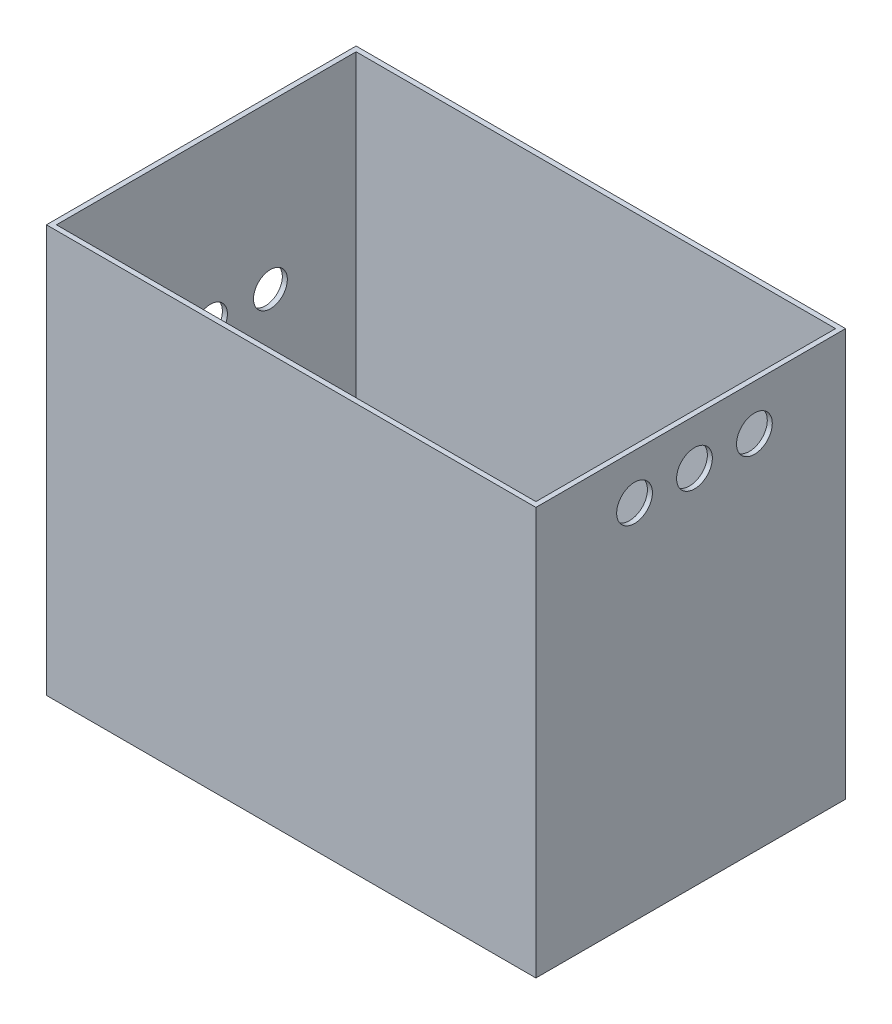
ISO-10303-21;
HEADER;
FILE_DESCRIPTION(('STEP AP214'),'2;1');
FILE_NAME('part.step','',(''),(''),'','','');
FILE_SCHEMA(('AUTOMOTIVE_DESIGN { 1 0 10303 214 1 1 1 1 }'));
ENDSEC;
DATA;
#1=APPLICATION_CONTEXT('core data for automotive mechanical design processes');
#2=APPLICATION_PROTOCOL_DEFINITION('international standard','automotive_design',2000,#1);
#3=PRODUCT_CONTEXT('',#1,'mechanical');
#4=PRODUCT('Part','Part','',(#3));
#5=PRODUCT_RELATED_PRODUCT_CATEGORY('part','',(#4));
#6=PRODUCT_DEFINITION_FORMATION('','',#4);
#7=PRODUCT_DEFINITION_CONTEXT('part definition',#1,'design');
#8=PRODUCT_DEFINITION('design','',#6,#7);
#9=PRODUCT_DEFINITION_SHAPE('','',#8);
#10=(LENGTH_UNIT() NAMED_UNIT(*) SI_UNIT(.MILLI.,.METRE.));
#11=(NAMED_UNIT(*) PLANE_ANGLE_UNIT() SI_UNIT($,.RADIAN.));
#12=(NAMED_UNIT(*) SI_UNIT($,.STERADIAN.) SOLID_ANGLE_UNIT());
#13=UNCERTAINTY_MEASURE_WITH_UNIT(LENGTH_MEASURE(1.E-05),#10,'distance_accuracy_value','');
#14=(GEOMETRIC_REPRESENTATION_CONTEXT(3) GLOBAL_UNCERTAINTY_ASSIGNED_CONTEXT((#13)) GLOBAL_UNIT_ASSIGNED_CONTEXT((#10,
#11,#12)) REPRESENTATION_CONTEXT('',''));
#15=CARTESIAN_POINT('',(0.,0.,0.));
#16=DIRECTION('',(0.,0.,1.));
#17=DIRECTION('',(1.,0.,0.));
#18=AXIS2_PLACEMENT_3D('',#15,#16,#17);
#19=CARTESIAN_POINT('',(-155.575,0.,98.425));
#20=DIRECTION('',(-1.,0.,0.));
#21=DIRECTION('',(0.,0.,1.));
#22=AXIS2_PLACEMENT_3D('',#19,#20,#21);
#23=PLANE('',#22);
#24=CARTESIAN_POINT('',(-155.575,155.631127925775,-40.7826472448555));
#25=DIRECTION('',(-1.,0.,0.));
#26=DIRECTION('',(0.,0.,1.));
#27=AXIS2_PLACEMENT_3D('',#24,#25,#26);
#28=CIRCLE('',#27,10.7594250898083);
#29=CARTESIAN_POINT('',(-155.575,155.631127925775,-30.0232221550472));
#30=VERTEX_POINT('',#29);
#31=EDGE_CURVE('E183',#30,#30,#28,.T.);
#32=ORIENTED_EDGE('',*,*,#31,.F.);
#33=EDGE_LOOP('',(#32));
#34=FACE_BOUND('',#33,.T.);
#35=CARTESIAN_POINT('',(-155.575,155.631127925775,-2.68264724485547));
#36=DIRECTION('',(-1.,0.,0.));
#37=DIRECTION('',(0.,0.,1.));
#38=AXIS2_PLACEMENT_3D('',#35,#36,#37);
#39=CIRCLE('',#38,10.7594250898083);
#40=CARTESIAN_POINT('',(-155.575,155.631127925775,8.07677784495281));
#41=VERTEX_POINT('',#40);
#42=EDGE_CURVE('E199',#41,#41,#39,.T.);
#43=ORIENTED_EDGE('',*,*,#42,.F.);
#44=EDGE_LOOP('',(#43));
#45=FACE_BOUND('',#44,.T.);
#46=CARTESIAN_POINT('',(-155.575,155.631127925775,35.4173527551445));
#47=DIRECTION('',(-1.,0.,0.));
#48=DIRECTION('',(0.,0.,1.));
#49=AXIS2_PLACEMENT_3D('',#46,#47,#48);
#50=CIRCLE('',#49,10.7594250898083);
#51=CARTESIAN_POINT('',(-155.575,155.631127925775,46.1767778449528));
#52=VERTEX_POINT('',#51);
#53=EDGE_CURVE('E135',#52,#52,#50,.T.);
#54=ORIENTED_EDGE('',*,*,#53,.F.);
#55=EDGE_LOOP('',(#54));
#56=FACE_BOUND('',#55,.T.);
#57=DIRECTION('',(0.,1.,0.));
#58=VECTOR('',#57,1.);
#59=CARTESIAN_POINT('',(-155.575,0.,98.425));
#60=LINE('',#59,#58);
#61=CARTESIAN_POINT('',(-155.575,0.,98.425));
#62=VERTEX_POINT('',#61);
#63=CARTESIAN_POINT('',(-155.575,259.08,98.425));
#64=VERTEX_POINT('',#63);
#65=EDGE_CURVE('E173',#62,#64,#60,.T.);
#66=ORIENTED_EDGE('',*,*,#65,.T.);
#67=DIRECTION('',(0.,0.,1.));
#68=VECTOR('',#67,1.);
#69=CARTESIAN_POINT('',(-155.575,259.08,98.425));
#70=LINE('',#69,#68);
#71=CARTESIAN_POINT('',(-155.575,259.08,-98.425));
#72=VERTEX_POINT('',#71);
#73=EDGE_CURVE('E148',#72,#64,#70,.T.);
#74=ORIENTED_EDGE('',*,*,#73,.F.);
#75=DIRECTION('',(0.,1.,0.));
#76=VECTOR('',#75,1.);
#77=CARTESIAN_POINT('',(-155.575,0.,-98.425));
#78=LINE('',#77,#76);
#79=CARTESIAN_POINT('',(-155.575,0.,-98.425));
#80=VERTEX_POINT('',#79);
#81=EDGE_CURVE('E11',#80,#72,#78,.T.);
#82=ORIENTED_EDGE('',*,*,#81,.F.);
#83=DIRECTION('',(0.,0.,1.));
#84=VECTOR('',#83,1.);
#85=CARTESIAN_POINT('',(-155.575,0.,98.425));
#86=LINE('',#85,#84);
#87=EDGE_CURVE('E163',#80,#62,#86,.T.);
#88=ORIENTED_EDGE('',*,*,#87,.T.);
#89=EDGE_LOOP('',(#66,#74,#82,#88));
#90=FACE_BOUND('',#89,.T.);
#91=ADVANCED_FACE('F43',(#34,#45,#56,#90),#23,.T.);
#92=CARTESIAN_POINT('',(155.575,0.,-98.4250000000001));
#93=DIRECTION('',(0.,0.,-1.));
#94=DIRECTION('',(-1.,0.,0.));
#95=AXIS2_PLACEMENT_3D('',#92,#93,#94);
#96=PLANE('',#95);
#97=ORIENTED_EDGE('',*,*,#81,.T.);
#98=DIRECTION('',(-1.,0.,0.));
#99=VECTOR('',#98,1.);
#100=CARTESIAN_POINT('',(155.575,259.08,-98.4250000000001));
#101=LINE('',#100,#99);
#102=CARTESIAN_POINT('',(155.575,259.08,-98.4250000000001));
#103=VERTEX_POINT('',#102);
#104=EDGE_CURVE('E160',#103,#72,#101,.T.);
#105=ORIENTED_EDGE('',*,*,#104,.F.);
#106=DIRECTION('',(0.,1.,0.));
#107=VECTOR('',#106,1.);
#108=CARTESIAN_POINT('',(155.575,0.,-98.4250000000001));
#109=LINE('',#108,#107);
#110=CARTESIAN_POINT('',(155.575,0.,-98.4250000000001));
#111=VERTEX_POINT('',#110);
#112=EDGE_CURVE('E52',#111,#103,#109,.T.);
#113=ORIENTED_EDGE('',*,*,#112,.F.);
#114=DIRECTION('',(-1.,0.,0.));
#115=VECTOR('',#114,1.);
#116=CARTESIAN_POINT('',(155.575,0.,-98.4250000000001));
#117=LINE('',#116,#115);
#118=EDGE_CURVE('E171',#111,#80,#117,.T.);
#119=ORIENTED_EDGE('',*,*,#118,.T.);
#120=EDGE_LOOP('',(#97,#105,#113,#119));
#121=FACE_BOUND('',#120,.T.);
#122=ADVANCED_FACE('F224',(#121),#96,.T.);
#123=CARTESIAN_POINT('',(155.575,0.,98.4249999999999));
#124=DIRECTION('',(1.,0.,0.));
#125=DIRECTION('',(0.,0.,-1.));
#126=AXIS2_PLACEMENT_3D('',#123,#124,#125);
#127=PLANE('',#126);
#128=CARTESIAN_POINT('',(155.575,230.210156067232,35.7250249221631));
#129=DIRECTION('',(1.,0.,0.));
#130=DIRECTION('',(0.,0.,-1.));
#131=AXIS2_PLACEMENT_3D('',#128,#129,#130);
#132=CIRCLE('',#131,11.3686100099966);
#133=CARTESIAN_POINT('',(155.575,230.210156067232,24.3564149121664));
#134=VERTEX_POINT('',#133);
#135=EDGE_CURVE('E191',#134,#134,#132,.T.);
#136=ORIENTED_EDGE('',*,*,#135,.F.);
#137=EDGE_LOOP('',(#136));
#138=FACE_BOUND('',#137,.T.);
#139=CARTESIAN_POINT('',(155.575,230.210156067232,-2.37497507783692));
#140=DIRECTION('',(1.,0.,0.));
#141=DIRECTION('',(0.,0.,-1.));
#142=AXIS2_PLACEMENT_3D('',#139,#140,#141);
#143=CIRCLE('',#142,11.3686100099966);
#144=CARTESIAN_POINT('',(155.575,230.210156067232,-13.7435850878335));
#145=VERTEX_POINT('',#144);
#146=EDGE_CURVE('E211',#145,#145,#143,.T.);
#147=ORIENTED_EDGE('',*,*,#146,.F.);
#148=EDGE_LOOP('',(#147));
#149=FACE_BOUND('',#148,.T.);
#150=CARTESIAN_POINT('',(155.575,230.210156067232,-40.4749750778369));
#151=DIRECTION('',(1.,0.,0.));
#152=DIRECTION('',(0.,0.,-1.));
#153=AXIS2_PLACEMENT_3D('',#150,#151,#152);
#154=CIRCLE('',#153,11.3686100099966);
#155=CARTESIAN_POINT('',(155.575,230.210156067232,-51.8435850878336));
#156=VERTEX_POINT('',#155);
#157=EDGE_CURVE('E208',#156,#156,#154,.T.);
#158=ORIENTED_EDGE('',*,*,#157,.F.);
#159=EDGE_LOOP('',(#158));
#160=FACE_BOUND('',#159,.T.);
#161=ORIENTED_EDGE('',*,*,#112,.T.);
#162=DIRECTION('',(0.,0.,-1.));
#163=VECTOR('',#162,1.);
#164=CARTESIAN_POINT('',(155.575,259.08,98.4249999999999));
#165=LINE('',#164,#163);
#166=CARTESIAN_POINT('',(155.575,259.08,98.4249999999999));
#167=VERTEX_POINT('',#166);
#168=EDGE_CURVE('E157',#167,#103,#165,.T.);
#169=ORIENTED_EDGE('',*,*,#168,.F.);
#170=DIRECTION('',(0.,1.,0.));
#171=VECTOR('',#170,1.);
#172=CARTESIAN_POINT('',(155.575,0.,98.4249999999999));
#173=LINE('',#172,#171);
#174=CARTESIAN_POINT('',(155.575,0.,98.4249999999999));
#175=VERTEX_POINT('',#174);
#176=EDGE_CURVE('E176',#175,#167,#173,.T.);
#177=ORIENTED_EDGE('',*,*,#176,.F.);
#178=DIRECTION('',(0.,0.,-1.));
#179=VECTOR('',#178,1.);
#180=CARTESIAN_POINT('',(155.575,0.,98.4249999999999));
#181=LINE('',#180,#179);
#182=EDGE_CURVE('E168',#175,#111,#181,.T.);
#183=ORIENTED_EDGE('',*,*,#182,.T.);
#184=EDGE_LOOP('',(#161,#169,#177,#183));
#185=FACE_BOUND('',#184,.T.);
#186=ADVANCED_FACE('F220',(#138,#149,#160,#185),#127,.T.);
#187=CARTESIAN_POINT('',(155.575,0.,98.4249999999999));
#188=DIRECTION('',(0.,0.,1.));
#189=DIRECTION('',(1.,0.,0.));
#190=AXIS2_PLACEMENT_3D('',#187,#188,#189);
#191=PLANE('',#190);
#192=ORIENTED_EDGE('',*,*,#176,.T.);
#193=DIRECTION('',(1.,0.,0.));
#194=VECTOR('',#193,1.);
#195=CARTESIAN_POINT('',(155.575,259.08,98.4249999999999));
#196=LINE('',#195,#194);
#197=EDGE_CURVE('E154',#64,#167,#196,.T.);
#198=ORIENTED_EDGE('',*,*,#197,.F.);
#199=ORIENTED_EDGE('',*,*,#65,.F.);
#200=DIRECTION('',(1.,0.,0.));
#201=VECTOR('',#200,1.);
#202=CARTESIAN_POINT('',(155.575,0.,98.4249999999999));
#203=LINE('',#202,#201);
#204=EDGE_CURVE('E165',#62,#175,#203,.T.);
#205=ORIENTED_EDGE('',*,*,#204,.T.);
#206=EDGE_LOOP('',(#192,#198,#199,#205));
#207=FACE_BOUND('',#206,.T.);
#208=ADVANCED_FACE('F223',(#207),#191,.T.);
#209=CARTESIAN_POINT('',(0.,259.08,0.));
#210=DIRECTION('',(0.,1.,0.));
#211=DIRECTION('',(0.,0.,1.));
#212=AXIS2_PLACEMENT_3D('',#209,#210,#211);
#213=PLANE('',#212);
#214=DIRECTION('',(0.,0.,1.));
#215=VECTOR('',#214,1.);
#216=CARTESIAN_POINT('',(-152.4,259.08,95.2500000000001));
#217=LINE('',#216,#215);
#218=CARTESIAN_POINT('',(-152.4,259.08,-95.2499999999999));
#219=VERTEX_POINT('',#218);
#220=CARTESIAN_POINT('',(-152.4,259.08,95.2500000000001));
#221=VERTEX_POINT('',#220);
#222=EDGE_CURVE('E60',#219,#221,#217,.T.);
#223=ORIENTED_EDGE('',*,*,#222,.F.);
#224=DIRECTION('',(-1.,0.,0.));
#225=VECTOR('',#224,1.);
#226=CARTESIAN_POINT('',(152.4,259.08,-95.25));
#227=LINE('',#226,#225);
#228=CARTESIAN_POINT('',(152.4,259.08,-95.25));
#229=VERTEX_POINT('',#228);
#230=EDGE_CURVE('E129',#229,#219,#227,.T.);
#231=ORIENTED_EDGE('',*,*,#230,.F.);
#232=DIRECTION('',(0.,0.,-1.));
#233=VECTOR('',#232,1.);
#234=CARTESIAN_POINT('',(152.4,259.08,95.25));
#235=LINE('',#234,#233);
#236=CARTESIAN_POINT('',(152.4,259.08,95.25));
#237=VERTEX_POINT('',#236);
#238=EDGE_CURVE('E132',#237,#229,#235,.T.);
#239=ORIENTED_EDGE('',*,*,#238,.F.);
#240=DIRECTION('',(1.,0.,0.));
#241=VECTOR('',#240,1.);
#242=CARTESIAN_POINT('',(152.4,259.08,95.25));
#243=LINE('',#242,#241);
#244=EDGE_CURVE('E141',#221,#237,#243,.T.);
#245=ORIENTED_EDGE('',*,*,#244,.F.);
#246=EDGE_LOOP('',(#223,#231,#239,#245));
#247=FACE_BOUND('',#246,.T.);
#248=ORIENTED_EDGE('',*,*,#73,.T.);
#249=ORIENTED_EDGE('',*,*,#197,.T.);
#250=ORIENTED_EDGE('',*,*,#168,.T.);
#251=ORIENTED_EDGE('',*,*,#104,.T.);
#252=EDGE_LOOP('',(#248,#249,#250,#251));
#253=FACE_BOUND('',#252,.T.);
#254=ADVANCED_FACE('F236',(#247,#253),#213,.T.);
#255=CARTESIAN_POINT('',(0.,0.,0.));
#256=DIRECTION('',(0.,1.,0.));
#257=DIRECTION('',(0.,0.,1.));
#258=AXIS2_PLACEMENT_3D('',#255,#256,#257);
#259=PLANE('',#258);
#260=ORIENTED_EDGE('',*,*,#87,.F.);
#261=ORIENTED_EDGE('',*,*,#118,.F.);
#262=ORIENTED_EDGE('',*,*,#182,.F.);
#263=ORIENTED_EDGE('',*,*,#204,.F.);
#264=EDGE_LOOP('',(#260,#261,#262,#263));
#265=FACE_BOUND('',#264,.T.);
#266=ADVANCED_FACE('F45',(#265),#259,.F.);
#267=CARTESIAN_POINT('',(-152.4,6.35000000000008,95.2500000000001));
#268=DIRECTION('',(-1.,0.,0.));
#269=DIRECTION('',(0.,0.,1.));
#270=AXIS2_PLACEMENT_3D('',#267,#268,#269);
#271=PLANE('',#270);
#272=CARTESIAN_POINT('',(-152.4,155.631127925775,-40.7826472448555));
#273=DIRECTION('',(-1.,0.,0.));
#274=DIRECTION('',(0.,0.,1.));
#275=AXIS2_PLACEMENT_3D('',#272,#273,#274);
#276=CIRCLE('',#275,10.7594250898083);
#277=CARTESIAN_POINT('',(-152.4,155.631127925775,-30.0232221550472));
#278=VERTEX_POINT('',#277);
#279=EDGE_CURVE('E142',#278,#278,#276,.T.);
#280=ORIENTED_EDGE('',*,*,#279,.T.);
#281=EDGE_LOOP('',(#280));
#282=FACE_BOUND('',#281,.T.);
#283=CARTESIAN_POINT('',(-152.4,155.631127925775,-2.68264724485547));
#284=DIRECTION('',(-1.,0.,0.));
#285=DIRECTION('',(0.,0.,1.));
#286=AXIS2_PLACEMENT_3D('',#283,#284,#285);
#287=CIRCLE('',#286,10.7594250898083);
#288=CARTESIAN_POINT('',(-152.4,155.631127925775,8.07677784495281));
#289=VERTEX_POINT('',#288);
#290=EDGE_CURVE('E182',#289,#289,#287,.T.);
#291=ORIENTED_EDGE('',*,*,#290,.T.);
#292=EDGE_LOOP('',(#291));
#293=FACE_BOUND('',#292,.T.);
#294=CARTESIAN_POINT('',(-152.4,155.631127925775,35.4173527551445));
#295=DIRECTION('',(-1.,0.,0.));
#296=DIRECTION('',(0.,0.,1.));
#297=AXIS2_PLACEMENT_3D('',#294,#295,#296);
#298=CIRCLE('',#297,10.7594250898083);
#299=CARTESIAN_POINT('',(-152.4,155.631127925775,46.1767778449528));
#300=VERTEX_POINT('',#299);
#301=EDGE_CURVE('E179',#300,#300,#298,.T.);
#302=ORIENTED_EDGE('',*,*,#301,.T.);
#303=EDGE_LOOP('',(#302));
#304=FACE_BOUND('',#303,.T.);
#305=ORIENTED_EDGE('',*,*,#222,.T.);
#306=DIRECTION('',(0.,1.,0.));
#307=VECTOR('',#306,1.);
#308=CARTESIAN_POINT('',(-152.4,6.35000000000008,95.2500000000001));
#309=LINE('',#308,#307);
#310=CARTESIAN_POINT('',(-152.4,6.35000000000008,95.2500000000001));
#311=VERTEX_POINT('',#310);
#312=EDGE_CURVE('E107',#311,#221,#309,.T.);
#313=ORIENTED_EDGE('',*,*,#312,.F.);
#314=DIRECTION('',(0.,0.,1.));
#315=VECTOR('',#314,1.);
#316=CARTESIAN_POINT('',(-152.4,6.35000000000008,95.2500000000001));
#317=LINE('',#316,#315);
#318=CARTESIAN_POINT('',(-152.4,6.35000000000008,-95.2499999999999));
#319=VERTEX_POINT('',#318);
#320=EDGE_CURVE('E111',#319,#311,#317,.T.);
#321=ORIENTED_EDGE('',*,*,#320,.F.);
#322=DIRECTION('',(0.,1.,0.));
#323=VECTOR('',#322,1.);
#324=CARTESIAN_POINT('',(-152.4,6.35000000000008,-95.2499999999999));
#325=LINE('',#324,#323);
#326=EDGE_CURVE('E146',#319,#219,#325,.T.);
#327=ORIENTED_EDGE('',*,*,#326,.T.);
#328=EDGE_LOOP('',(#305,#313,#321,#327));
#329=FACE_BOUND('',#328,.T.);
#330=ADVANCED_FACE('F109',(#282,#293,#304,#329),#271,.F.);
#331=CARTESIAN_POINT('',(152.4,6.35000000000008,-95.25));
#332=DIRECTION('',(0.,0.,-1.));
#333=DIRECTION('',(-1.,0.,0.));
#334=AXIS2_PLACEMENT_3D('',#331,#332,#333);
#335=PLANE('',#334);
#336=ORIENTED_EDGE('',*,*,#230,.T.);
#337=ORIENTED_EDGE('',*,*,#326,.F.);
#338=DIRECTION('',(-1.,0.,0.));
#339=VECTOR('',#338,1.);
#340=CARTESIAN_POINT('',(152.4,6.35000000000008,-95.25));
#341=LINE('',#340,#339);
#342=CARTESIAN_POINT('',(152.4,6.35000000000008,-95.25));
#343=VERTEX_POINT('',#342);
#344=EDGE_CURVE('E117',#343,#319,#341,.T.);
#345=ORIENTED_EDGE('',*,*,#344,.F.);
#346=DIRECTION('',(0.,1.,0.));
#347=VECTOR('',#346,1.);
#348=CARTESIAN_POINT('',(152.4,6.35000000000008,-95.25));
#349=LINE('',#348,#347);
#350=EDGE_CURVE('E149',#343,#229,#349,.T.);
#351=ORIENTED_EDGE('',*,*,#350,.T.);
#352=EDGE_LOOP('',(#336,#337,#345,#351));
#353=FACE_BOUND('',#352,.T.);
#354=ADVANCED_FACE('F270',(#353),#335,.F.);
#355=CARTESIAN_POINT('',(152.4,6.35000000000008,95.25));
#356=DIRECTION('',(1.,0.,0.));
#357=DIRECTION('',(0.,0.,-1.));
#358=AXIS2_PLACEMENT_3D('',#355,#356,#357);
#359=PLANE('',#358);
#360=CARTESIAN_POINT('',(152.4,230.210156067232,35.7250249221631));
#361=DIRECTION('',(1.,0.,0.));
#362=DIRECTION('',(0.,0.,-1.));
#363=AXIS2_PLACEMENT_3D('',#360,#361,#362);
#364=CIRCLE('',#363,11.3686100099966);
#365=CARTESIAN_POINT('',(152.4,230.210156067232,24.3564149121664));
#366=VERTEX_POINT('',#365);
#367=EDGE_CURVE('E47',#366,#366,#364,.T.);
#368=ORIENTED_EDGE('',*,*,#367,.T.);
#369=EDGE_LOOP('',(#368));
#370=FACE_BOUND('',#369,.T.);
#371=CARTESIAN_POINT('',(152.4,230.210156067232,-2.37497507783692));
#372=DIRECTION('',(1.,0.,0.));
#373=DIRECTION('',(0.,0.,-1.));
#374=AXIS2_PLACEMENT_3D('',#371,#372,#373);
#375=CIRCLE('',#374,11.3686100099966);
#376=CARTESIAN_POINT('',(152.4,230.210156067232,-13.7435850878335));
#377=VERTEX_POINT('',#376);
#378=EDGE_CURVE('E190',#377,#377,#375,.T.);
#379=ORIENTED_EDGE('',*,*,#378,.T.);
#380=EDGE_LOOP('',(#379));
#381=FACE_BOUND('',#380,.T.);
#382=CARTESIAN_POINT('',(152.4,230.210156067232,-40.4749750778369));
#383=DIRECTION('',(1.,0.,0.));
#384=DIRECTION('',(0.,0.,-1.));
#385=AXIS2_PLACEMENT_3D('',#382,#383,#384);
#386=CIRCLE('',#385,11.3686100099966);
#387=CARTESIAN_POINT('',(152.4,230.210156067232,-51.8435850878336));
#388=VERTEX_POINT('',#387);
#389=EDGE_CURVE('E188',#388,#388,#386,.T.);
#390=ORIENTED_EDGE('',*,*,#389,.T.);
#391=EDGE_LOOP('',(#390));
#392=FACE_BOUND('',#391,.T.);
#393=ORIENTED_EDGE('',*,*,#238,.T.);
#394=ORIENTED_EDGE('',*,*,#350,.F.);
#395=DIRECTION('',(0.,0.,-1.));
#396=VECTOR('',#395,1.);
#397=CARTESIAN_POINT('',(152.4,6.35000000000008,95.25));
#398=LINE('',#397,#396);
#399=CARTESIAN_POINT('',(152.4,6.35000000000008,95.25));
#400=VERTEX_POINT('',#399);
#401=EDGE_CURVE('E125',#400,#343,#398,.T.);
#402=ORIENTED_EDGE('',*,*,#401,.F.);
#403=DIRECTION('',(0.,1.,0.));
#404=VECTOR('',#403,1.);
#405=CARTESIAN_POINT('',(152.4,6.35000000000008,95.25));
#406=LINE('',#405,#404);
#407=EDGE_CURVE('E116',#400,#237,#406,.T.);
#408=ORIENTED_EDGE('',*,*,#407,.T.);
#409=EDGE_LOOP('',(#393,#394,#402,#408));
#410=FACE_BOUND('',#409,.T.);
#411=ADVANCED_FACE('F287',(#370,#381,#392,#410),#359,.F.);
#412=CARTESIAN_POINT('',(152.4,6.35000000000008,95.25));
#413=DIRECTION('',(0.,0.,1.));
#414=DIRECTION('',(1.,0.,0.));
#415=AXIS2_PLACEMENT_3D('',#412,#413,#414);
#416=PLANE('',#415);
#417=ORIENTED_EDGE('',*,*,#244,.T.);
#418=ORIENTED_EDGE('',*,*,#407,.F.);
#419=DIRECTION('',(1.,0.,0.));
#420=VECTOR('',#419,1.);
#421=CARTESIAN_POINT('',(152.4,6.35000000000008,95.25));
#422=LINE('',#421,#420);
#423=EDGE_CURVE('E120',#311,#400,#422,.T.);
#424=ORIENTED_EDGE('',*,*,#423,.F.);
#425=ORIENTED_EDGE('',*,*,#312,.T.);
#426=EDGE_LOOP('',(#417,#418,#424,#425));
#427=FACE_BOUND('',#426,.T.);
#428=ADVANCED_FACE('F121',(#427),#416,.F.);
#429=CARTESIAN_POINT('',(0.,6.35000000000008,0.));
#430=DIRECTION('',(0.,1.,0.));
#431=DIRECTION('',(0.,0.,1.));
#432=AXIS2_PLACEMENT_3D('',#429,#430,#431);
#433=PLANE('',#432);
#434=ORIENTED_EDGE('',*,*,#320,.T.);
#435=ORIENTED_EDGE('',*,*,#423,.T.);
#436=ORIENTED_EDGE('',*,*,#401,.T.);
#437=ORIENTED_EDGE('',*,*,#344,.T.);
#438=EDGE_LOOP('',(#434,#435,#436,#437));
#439=FACE_BOUND('',#438,.T.);
#440=ADVANCED_FACE('F127',(#439),#433,.T.);
#441=CARTESIAN_POINT('',(97.1549999999998,155.631127925775,35.4173527551445));
#442=DIRECTION('',(-1.,0.,0.));
#443=DIRECTION('',(0.,0.,1.));
#444=AXIS2_PLACEMENT_3D('',#441,#442,#443);
#445=CYLINDRICAL_SURFACE('',#444,10.7594250898083);
#446=ORIENTED_EDGE('',*,*,#53,.T.);
#447=EDGE_LOOP('',(#446));
#448=FACE_BOUND('',#447,.T.);
#449=ORIENTED_EDGE('',*,*,#301,.F.);
#450=EDGE_LOOP('',(#449));
#451=FACE_BOUND('',#450,.T.);
#452=ADVANCED_FACE('F276',(#448,#451),#445,.F.);
#453=CARTESIAN_POINT('',(97.1549999999998,155.631127925775,-2.68264724485547));
#454=DIRECTION('',(-1.,0.,0.));
#455=DIRECTION('',(0.,0.,1.));
#456=AXIS2_PLACEMENT_3D('',#453,#454,#455);
#457=CYLINDRICAL_SURFACE('',#456,10.7594250898083);
#458=ORIENTED_EDGE('',*,*,#42,.T.);
#459=EDGE_LOOP('',(#458));
#460=FACE_BOUND('',#459,.T.);
#461=ORIENTED_EDGE('',*,*,#290,.F.);
#462=EDGE_LOOP('',(#461));
#463=FACE_BOUND('',#462,.T.);
#464=ADVANCED_FACE('F265',(#460,#463),#457,.F.);
#465=CARTESIAN_POINT('',(97.1549999999998,155.631127925775,-40.7826472448555));
#466=DIRECTION('',(-1.,0.,0.));
#467=DIRECTION('',(0.,0.,1.));
#468=AXIS2_PLACEMENT_3D('',#465,#466,#467);
#469=CYLINDRICAL_SURFACE('',#468,10.7594250898083);
#470=ORIENTED_EDGE('',*,*,#31,.T.);
#471=EDGE_LOOP('',(#470));
#472=FACE_BOUND('',#471,.T.);
#473=ORIENTED_EDGE('',*,*,#279,.F.);
#474=EDGE_LOOP('',(#473));
#475=FACE_BOUND('',#474,.T.);
#476=ADVANCED_FACE('F261',(#472,#475),#469,.F.);
#477=CARTESIAN_POINT('',(-97.155,230.210156067232,-40.4749750778369));
#478=DIRECTION('',(1.,0.,0.));
#479=DIRECTION('',(0.,0.,-1.));
#480=AXIS2_PLACEMENT_3D('',#477,#478,#479);
#481=CYLINDRICAL_SURFACE('',#480,11.3686100099966);
#482=ORIENTED_EDGE('',*,*,#157,.T.);
#483=EDGE_LOOP('',(#482));
#484=FACE_BOUND('',#483,.T.);
#485=ORIENTED_EDGE('',*,*,#389,.F.);
#486=EDGE_LOOP('',(#485));
#487=FACE_BOUND('',#486,.T.);
#488=ADVANCED_FACE('F264',(#484,#487),#481,.F.);
#489=CARTESIAN_POINT('',(-97.155,230.210156067232,-2.37497507783692));
#490=DIRECTION('',(1.,0.,0.));
#491=DIRECTION('',(0.,0.,-1.));
#492=AXIS2_PLACEMENT_3D('',#489,#490,#491);
#493=CYLINDRICAL_SURFACE('',#492,11.3686100099966);
#494=ORIENTED_EDGE('',*,*,#146,.T.);
#495=EDGE_LOOP('',(#494));
#496=FACE_BOUND('',#495,.T.);
#497=ORIENTED_EDGE('',*,*,#378,.F.);
#498=EDGE_LOOP('',(#497));
#499=FACE_BOUND('',#498,.T.);
#500=ADVANCED_FACE('F328',(#496,#499),#493,.F.);
#501=CARTESIAN_POINT('',(-97.155,230.210156067232,35.7250249221631));
#502=DIRECTION('',(1.,0.,0.));
#503=DIRECTION('',(0.,0.,-1.));
#504=AXIS2_PLACEMENT_3D('',#501,#502,#503);
#505=CYLINDRICAL_SURFACE('',#504,11.3686100099966);
#506=ORIENTED_EDGE('',*,*,#135,.T.);
#507=EDGE_LOOP('',(#506));
#508=FACE_BOUND('',#507,.T.);
#509=ORIENTED_EDGE('',*,*,#367,.F.);
#510=EDGE_LOOP('',(#509));
#511=FACE_BOUND('',#510,.T.);
#512=ADVANCED_FACE('F217',(#508,#511),#505,.F.);
#513=CLOSED_SHELL('',(#91,#122,#186,#208,#254,#266,#330,#354,#411,#428,#440,#452,#464,#476,#488,
#500,#512));
#514=MANIFOLD_SOLID_BREP('B2',#513);
#515=ADVANCED_BREP_SHAPE_REPRESENTATION('',(#18,#514),#14);
#516=SHAPE_DEFINITION_REPRESENTATION(#9,#515);
ENDSEC;
END-ISO-10303-21;
